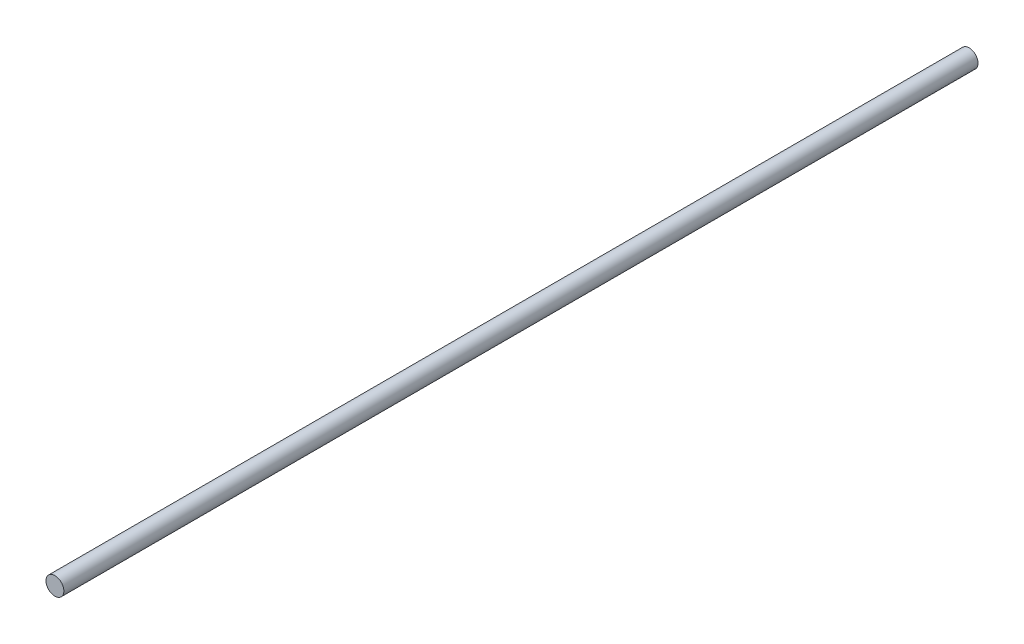
ISO-10303-21;
HEADER;
FILE_DESCRIPTION(('STEP AP214'),'2;1');
FILE_NAME('part.step','',(''),(''),'','','');
FILE_SCHEMA(('AUTOMOTIVE_DESIGN { 1 0 10303 214 1 1 1 1 }'));
ENDSEC;
DATA;
#1=APPLICATION_CONTEXT('core data for automotive mechanical design processes');
#2=APPLICATION_PROTOCOL_DEFINITION('international standard','automotive_design',2000,#1);
#3=PRODUCT_CONTEXT('',#1,'mechanical');
#4=PRODUCT('Part','Part','',(#3));
#5=PRODUCT_RELATED_PRODUCT_CATEGORY('part','',(#4));
#6=PRODUCT_DEFINITION_FORMATION('','',#4);
#7=PRODUCT_DEFINITION_CONTEXT('part definition',#1,'design');
#8=PRODUCT_DEFINITION('design','',#6,#7);
#9=PRODUCT_DEFINITION_SHAPE('','',#8);
#10=(LENGTH_UNIT() NAMED_UNIT(*) SI_UNIT(.MILLI.,.METRE.));
#11=(NAMED_UNIT(*) PLANE_ANGLE_UNIT() SI_UNIT($,.RADIAN.));
#12=(NAMED_UNIT(*) SI_UNIT($,.STERADIAN.) SOLID_ANGLE_UNIT());
#13=UNCERTAINTY_MEASURE_WITH_UNIT(LENGTH_MEASURE(1.E-05),#10,'distance_accuracy_value','');
#14=(GEOMETRIC_REPRESENTATION_CONTEXT(3) GLOBAL_UNCERTAINTY_ASSIGNED_CONTEXT((#13)) GLOBAL_UNIT_ASSIGNED_CONTEXT((#10,
#11,#12)) REPRESENTATION_CONTEXT('',''));
#15=CARTESIAN_POINT('',(0.,0.,0.));
#16=DIRECTION('',(0.,0.,1.));
#17=DIRECTION('',(1.,0.,0.));
#18=AXIS2_PLACEMENT_3D('',#15,#16,#17);
#19=CARTESIAN_POINT('',(0.,0.,512.));
#20=DIRECTION('',(0.,0.,-1.));
#21=DIRECTION('',(-1.,0.,0.));
#22=AXIS2_PLACEMENT_3D('',#19,#20,#21);
#23=CYLINDRICAL_SURFACE('',#22,5.);
#24=CARTESIAN_POINT('',(0.,0.,512.));
#25=DIRECTION('',(0.,0.,1.));
#26=DIRECTION('',(1.,0.,0.));
#27=AXIS2_PLACEMENT_3D('',#24,#25,#26);
#28=CIRCLE('',#27,5.);
#29=CARTESIAN_POINT('',(5.,0.,512.));
#30=VERTEX_POINT('',#29);
#31=EDGE_CURVE('E10',#30,#30,#28,.T.);
#32=ORIENTED_EDGE('',*,*,#31,.F.);
#33=EDGE_LOOP('',(#32));
#34=FACE_BOUND('',#33,.T.);
#35=CARTESIAN_POINT('',(0.,0.,0.));
#36=DIRECTION('',(0.,0.,1.));
#37=DIRECTION('',(1.,0.,0.));
#38=AXIS2_PLACEMENT_3D('',#35,#36,#37);
#39=CIRCLE('',#38,5.);
#40=CARTESIAN_POINT('',(5.,0.,0.));
#41=VERTEX_POINT('',#40);
#42=EDGE_CURVE('E34',#41,#41,#39,.T.);
#43=ORIENTED_EDGE('',*,*,#42,.T.);
#44=EDGE_LOOP('',(#43));
#45=FACE_BOUND('',#44,.T.);
#46=ADVANCED_FACE('F31',(#34,#45),#23,.T.);
#47=CARTESIAN_POINT('',(0.,0.,512.));
#48=DIRECTION('',(0.,0.,1.));
#49=DIRECTION('',(1.,0.,0.));
#50=AXIS2_PLACEMENT_3D('',#47,#48,#49);
#51=PLANE('',#50);
#52=ORIENTED_EDGE('',*,*,#31,.T.);
#53=EDGE_LOOP('',(#52));
#54=FACE_BOUND('',#53,.T.);
#55=ADVANCED_FACE('F46',(#54),#51,.T.);
#56=CARTESIAN_POINT('',(0.,0.,0.));
#57=DIRECTION('',(0.,0.,1.));
#58=DIRECTION('',(1.,0.,0.));
#59=AXIS2_PLACEMENT_3D('',#56,#57,#58);
#60=PLANE('',#59);
#61=ORIENTED_EDGE('',*,*,#42,.F.);
#62=EDGE_LOOP('',(#61));
#63=FACE_BOUND('',#62,.T.);
#64=ADVANCED_FACE('F44',(#63),#60,.F.);
#65=CLOSED_SHELL('',(#46,#55,#64));
#66=MANIFOLD_SOLID_BREP('B2',#65);
#67=ADVANCED_BREP_SHAPE_REPRESENTATION('',(#18,#66),#14);
#68=SHAPE_DEFINITION_REPRESENTATION(#9,#67);
ENDSEC;
END-ISO-10303-21;
